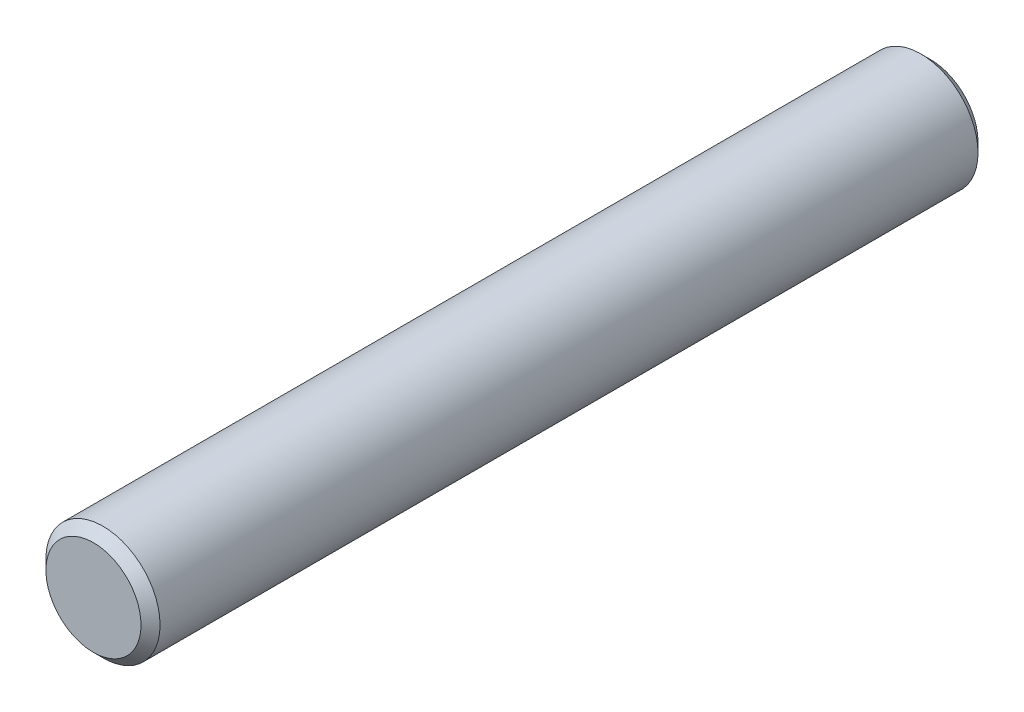
ISO-10303-21;
HEADER;
FILE_DESCRIPTION(('STEP AP214'),'2;1');
FILE_NAME('part.step','',(''),(''),'','','');
FILE_SCHEMA(('AUTOMOTIVE_DESIGN { 1 0 10303 214 1 1 1 1 }'));
ENDSEC;
DATA;
#1=APPLICATION_CONTEXT('core data for automotive mechanical design processes');
#2=APPLICATION_PROTOCOL_DEFINITION('international standard','automotive_design',2000,#1);
#3=PRODUCT_CONTEXT('',#1,'mechanical');
#4=PRODUCT('Part','Part','',(#3));
#5=PRODUCT_RELATED_PRODUCT_CATEGORY('part','',(#4));
#6=PRODUCT_DEFINITION_FORMATION('','',#4);
#7=PRODUCT_DEFINITION_CONTEXT('part definition',#1,'design');
#8=PRODUCT_DEFINITION('design','',#6,#7);
#9=PRODUCT_DEFINITION_SHAPE('','',#8);
#10=(LENGTH_UNIT() NAMED_UNIT(*) SI_UNIT(.MILLI.,.METRE.));
#11=(NAMED_UNIT(*) PLANE_ANGLE_UNIT() SI_UNIT($,.RADIAN.));
#12=(NAMED_UNIT(*) SI_UNIT($,.STERADIAN.) SOLID_ANGLE_UNIT());
#13=UNCERTAINTY_MEASURE_WITH_UNIT(LENGTH_MEASURE(1.E-05),#10,'distance_accuracy_value','');
#14=(GEOMETRIC_REPRESENTATION_CONTEXT(3) GLOBAL_UNCERTAINTY_ASSIGNED_CONTEXT((#13)) GLOBAL_UNIT_ASSIGNED_CONTEXT((#10,
#11,#12)) REPRESENTATION_CONTEXT('',''));
#15=CARTESIAN_POINT('',(0.,0.,0.));
#16=DIRECTION('',(0.,0.,1.));
#17=DIRECTION('',(1.,0.,0.));
#18=AXIS2_PLACEMENT_3D('',#15,#16,#17);
#19=CARTESIAN_POINT('',(0.,0.,44.));
#20=DIRECTION('',(0.,0.,-1.));
#21=DIRECTION('',(-1.,0.,0.));
#22=AXIS2_PLACEMENT_3D('',#19,#20,#21);
#23=CYLINDRICAL_SURFACE('',#22,3.);
#24=CARTESIAN_POINT('',(0.,0.,0.500000000000007));
#25=DIRECTION('',(0.,0.,1.));
#26=DIRECTION('',(1.,0.,0.));
#27=AXIS2_PLACEMENT_3D('',#24,#25,#26);
#28=CIRCLE('',#27,3.);
#29=CARTESIAN_POINT('',(3.,0.,0.500000000000007));
#30=VERTEX_POINT('',#29);
#31=EDGE_CURVE('E53',#30,#30,#28,.T.);
#32=ORIENTED_EDGE('',*,*,#31,.T.);
#33=EDGE_LOOP('',(#32));
#34=FACE_BOUND('',#33,.T.);
#35=CARTESIAN_POINT('',(0.,0.,43.5));
#36=DIRECTION('',(0.,0.,1.));
#37=DIRECTION('',(1.,0.,0.));
#38=AXIS2_PLACEMENT_3D('',#35,#36,#37);
#39=CIRCLE('',#38,3.);
#40=CARTESIAN_POINT('',(3.,0.,43.5));
#41=VERTEX_POINT('',#40);
#42=EDGE_CURVE('E58',#41,#41,#39,.F.);
#43=ORIENTED_EDGE('',*,*,#42,.T.);
#44=EDGE_LOOP('',(#43));
#45=FACE_BOUND('',#44,.T.);
#46=ADVANCED_FACE('F39',(#34,#45),#23,.T.);
#47=CARTESIAN_POINT('',(0.,0.,44.));
#48=DIRECTION('',(0.,0.,1.));
#49=DIRECTION('',(1.,0.,0.));
#50=AXIS2_PLACEMENT_3D('',#47,#48,#49);
#51=PLANE('',#50);
#52=CARTESIAN_POINT('',(0.,0.,44.));
#53=DIRECTION('',(0.,0.,1.));
#54=DIRECTION('',(1.,0.,0.));
#55=AXIS2_PLACEMENT_3D('',#52,#53,#54);
#56=CIRCLE('',#55,2.5);
#57=CARTESIAN_POINT('',(2.5,0.,44.));
#58=VERTEX_POINT('',#57);
#59=EDGE_CURVE('E10',#58,#58,#56,.T.);
#60=ORIENTED_EDGE('',*,*,#59,.T.);
#61=EDGE_LOOP('',(#60));
#62=FACE_BOUND('',#61,.T.);
#63=ADVANCED_FACE('F75',(#62),#51,.T.);
#64=CARTESIAN_POINT('',(0.,0.,0.));
#65=DIRECTION('',(0.,0.,1.));
#66=DIRECTION('',(1.,0.,0.));
#67=AXIS2_PLACEMENT_3D('',#64,#65,#66);
#68=PLANE('',#67);
#69=CARTESIAN_POINT('',(0.,0.,0.));
#70=DIRECTION('',(0.,0.,1.));
#71=DIRECTION('',(1.,0.,0.));
#72=AXIS2_PLACEMENT_3D('',#69,#70,#71);
#73=CIRCLE('',#72,2.49999999999999);
#74=CARTESIAN_POINT('',(2.49999999999999,0.,0.));
#75=VERTEX_POINT('',#74);
#76=EDGE_CURVE('E48',#75,#75,#73,.F.);
#77=ORIENTED_EDGE('',*,*,#76,.T.);
#78=EDGE_LOOP('',(#77));
#79=FACE_BOUND('',#78,.T.);
#80=ADVANCED_FACE('F72',(#79),#68,.F.);
#81=CARTESIAN_POINT('',(0.,0.,0.500000000000007));
#82=DIRECTION('',(0.,0.,1.));
#83=DIRECTION('',(1.,0.,0.));
#84=AXIS2_PLACEMENT_3D('',#81,#82,#83);
#85=CONICAL_SURFACE('',#84,3.,0.785398163397453);
#86=ORIENTED_EDGE('',*,*,#76,.F.);
#87=EDGE_LOOP('',(#86));
#88=FACE_BOUND('',#87,.T.);
#89=ORIENTED_EDGE('',*,*,#31,.F.);
#90=EDGE_LOOP('',(#89));
#91=FACE_BOUND('',#90,.T.);
#92=ADVANCED_FACE('F68',(#88,#91),#85,.T.);
#93=CARTESIAN_POINT('',(0.,0.,44.));
#94=DIRECTION('',(0.,0.,-1.));
#95=DIRECTION('',(-1.,0.,0.));
#96=AXIS2_PLACEMENT_3D('',#93,#94,#95);
#97=CONICAL_SURFACE('',#96,2.5,0.785398163397446);
#98=ORIENTED_EDGE('',*,*,#42,.F.);
#99=EDGE_LOOP('',(#98));
#100=FACE_BOUND('',#99,.T.);
#101=ORIENTED_EDGE('',*,*,#59,.F.);
#102=EDGE_LOOP('',(#101));
#103=FACE_BOUND('',#102,.T.);
#104=ADVANCED_FACE('F42',(#100,#103),#97,.T.);
#105=CLOSED_SHELL('',(#46,#63,#80,#92,#104));
#106=MANIFOLD_SOLID_BREP('B2',#105);
#107=ADVANCED_BREP_SHAPE_REPRESENTATION('',(#18,#106),#14);
#108=SHAPE_DEFINITION_REPRESENTATION(#9,#107);
ENDSEC;
END-ISO-10303-21;
